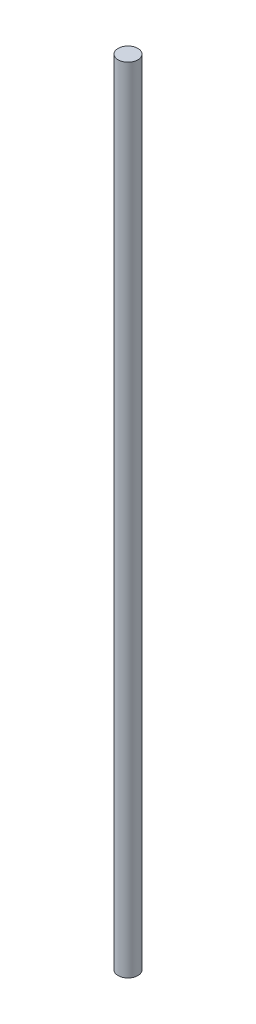
ISO-10303-21;
HEADER;
FILE_DESCRIPTION(('STEP AP214'),'2;1');
FILE_NAME('part.step','',(''),(''),'','','');
FILE_SCHEMA(('AUTOMOTIVE_DESIGN { 1 0 10303 214 1 1 1 1 }'));
ENDSEC;
DATA;
#1=APPLICATION_CONTEXT('core data for automotive mechanical design processes');
#2=APPLICATION_PROTOCOL_DEFINITION('international standard','automotive_design',2000,#1);
#3=PRODUCT_CONTEXT('',#1,'mechanical');
#4=PRODUCT('Part','Part','',(#3));
#5=PRODUCT_RELATED_PRODUCT_CATEGORY('part','',(#4));
#6=PRODUCT_DEFINITION_FORMATION('','',#4);
#7=PRODUCT_DEFINITION_CONTEXT('part definition',#1,'design');
#8=PRODUCT_DEFINITION('design','',#6,#7);
#9=PRODUCT_DEFINITION_SHAPE('','',#8);
#10=(LENGTH_UNIT() NAMED_UNIT(*) SI_UNIT(.MILLI.,.METRE.));
#11=(NAMED_UNIT(*) PLANE_ANGLE_UNIT() SI_UNIT($,.RADIAN.));
#12=(NAMED_UNIT(*) SI_UNIT($,.STERADIAN.) SOLID_ANGLE_UNIT());
#13=UNCERTAINTY_MEASURE_WITH_UNIT(LENGTH_MEASURE(1.E-05),#10,'distance_accuracy_value','');
#14=(GEOMETRIC_REPRESENTATION_CONTEXT(3) GLOBAL_UNCERTAINTY_ASSIGNED_CONTEXT((#13)) GLOBAL_UNIT_ASSIGNED_CONTEXT((#10,
#11,#12)) REPRESENTATION_CONTEXT('',''));
#15=CARTESIAN_POINT('',(0.,0.,0.));
#16=DIRECTION('',(0.,0.,1.));
#17=DIRECTION('',(1.,0.,0.));
#18=AXIS2_PLACEMENT_3D('',#15,#16,#17);
#19=CARTESIAN_POINT('',(0.,100.,0.));
#20=DIRECTION('',(0.,-1.,0.));
#21=DIRECTION('',(0.,0.,-1.));
#22=AXIS2_PLACEMENT_3D('',#19,#20,#21);
#23=CYLINDRICAL_SURFACE('',#22,2.5);
#24=CARTESIAN_POINT('',(0.,100.,0.));
#25=DIRECTION('',(0.,1.,0.));
#26=DIRECTION('',(0.,0.,1.));
#27=AXIS2_PLACEMENT_3D('',#24,#25,#26);
#28=CIRCLE('',#27,2.5);
#29=CARTESIAN_POINT('',(0.,100.,2.5));
#30=VERTEX_POINT('',#29);
#31=EDGE_CURVE('E10',#30,#30,#28,.T.);
#32=ORIENTED_EDGE('',*,*,#31,.F.);
#33=EDGE_LOOP('',(#32));
#34=FACE_BOUND('',#33,.T.);
#35=CARTESIAN_POINT('',(0.,-100.,0.));
#36=DIRECTION('',(0.,1.,0.));
#37=DIRECTION('',(0.,0.,1.));
#38=AXIS2_PLACEMENT_3D('',#35,#36,#37);
#39=CIRCLE('',#38,2.5);
#40=CARTESIAN_POINT('',(0.,-100.,2.5));
#41=VERTEX_POINT('',#40);
#42=EDGE_CURVE('E37',#41,#41,#39,.T.);
#43=ORIENTED_EDGE('',*,*,#42,.T.);
#44=EDGE_LOOP('',(#43));
#45=FACE_BOUND('',#44,.T.);
#46=ADVANCED_FACE('F34',(#34,#45),#23,.T.);
#47=CARTESIAN_POINT('',(0.,100.,0.));
#48=DIRECTION('',(0.,1.,0.));
#49=DIRECTION('',(0.,0.,1.));
#50=AXIS2_PLACEMENT_3D('',#47,#48,#49);
#51=PLANE('',#50);
#52=ORIENTED_EDGE('',*,*,#31,.T.);
#53=EDGE_LOOP('',(#52));
#54=FACE_BOUND('',#53,.T.);
#55=ADVANCED_FACE('F49',(#54),#51,.T.);
#56=CARTESIAN_POINT('',(0.,-100.,0.));
#57=DIRECTION('',(0.,1.,0.));
#58=DIRECTION('',(0.,0.,1.));
#59=AXIS2_PLACEMENT_3D('',#56,#57,#58);
#60=PLANE('',#59);
#61=ORIENTED_EDGE('',*,*,#42,.F.);
#62=EDGE_LOOP('',(#61));
#63=FACE_BOUND('',#62,.T.);
#64=ADVANCED_FACE('F47',(#63),#60,.F.);
#65=CLOSED_SHELL('',(#46,#55,#64));
#66=MANIFOLD_SOLID_BREP('B2',#65);
#67=ADVANCED_BREP_SHAPE_REPRESENTATION('',(#18,#66),#14);
#68=SHAPE_DEFINITION_REPRESENTATION(#9,#67);
ENDSEC;
END-ISO-10303-21;
